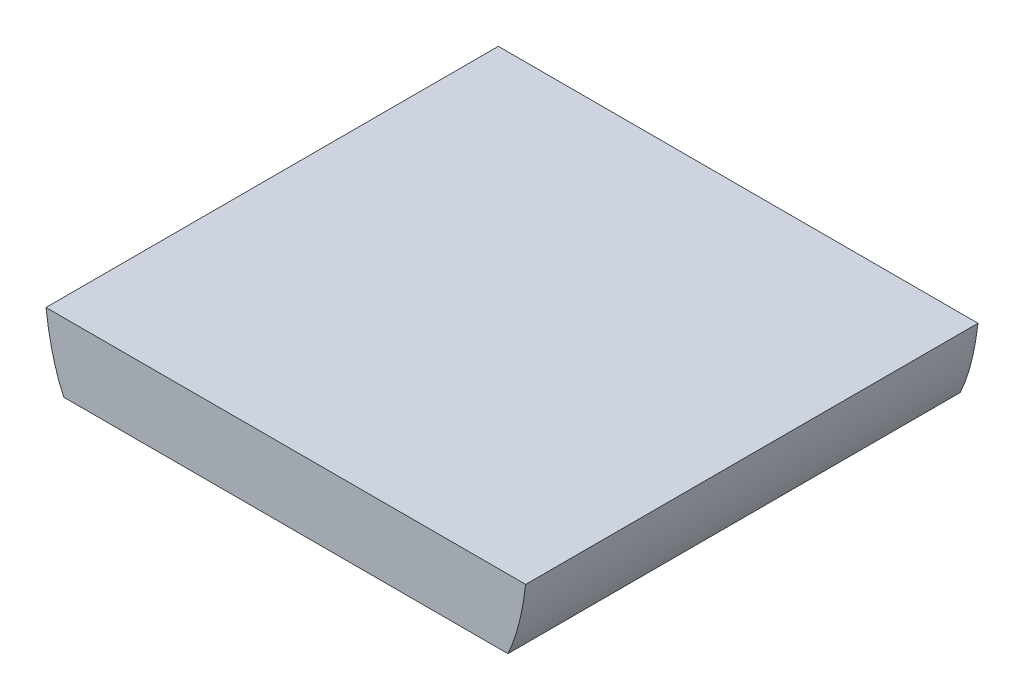
ISO-10303-21;
HEADER;
FILE_DESCRIPTION(('STEP AP214'),'2;1');
FILE_NAME('part.step','',(''),(''),'','','');
FILE_SCHEMA(('AUTOMOTIVE_DESIGN { 1 0 10303 214 1 1 1 1 }'));
ENDSEC;
DATA;
#1=APPLICATION_CONTEXT('core data for automotive mechanical design processes');
#2=APPLICATION_PROTOCOL_DEFINITION('international standard','automotive_design',2000,#1);
#3=PRODUCT_CONTEXT('',#1,'mechanical');
#4=PRODUCT('Part','Part','',(#3));
#5=PRODUCT_RELATED_PRODUCT_CATEGORY('part','',(#4));
#6=PRODUCT_DEFINITION_FORMATION('','',#4);
#7=PRODUCT_DEFINITION_CONTEXT('part definition',#1,'design');
#8=PRODUCT_DEFINITION('design','',#6,#7);
#9=PRODUCT_DEFINITION_SHAPE('','',#8);
#10=(LENGTH_UNIT() NAMED_UNIT(*) SI_UNIT(.MILLI.,.METRE.));
#11=(NAMED_UNIT(*) PLANE_ANGLE_UNIT() SI_UNIT($,.RADIAN.));
#12=(NAMED_UNIT(*) SI_UNIT($,.STERADIAN.) SOLID_ANGLE_UNIT());
#13=UNCERTAINTY_MEASURE_WITH_UNIT(LENGTH_MEASURE(1.E-05),#10,'distance_accuracy_value','');
#14=(GEOMETRIC_REPRESENTATION_CONTEXT(3) GLOBAL_UNCERTAINTY_ASSIGNED_CONTEXT((#13)) GLOBAL_UNIT_ASSIGNED_CONTEXT((#10,
#11,#12)) REPRESENTATION_CONTEXT('',''));
#15=CARTESIAN_POINT('',(0.,0.,0.));
#16=DIRECTION('',(0.,0.,1.));
#17=DIRECTION('',(1.,0.,0.));
#18=AXIS2_PLACEMENT_3D('',#15,#16,#17);
#19=CARTESIAN_POINT('',(-363.688822471691,122.174,-330.21));
#20=DIRECTION('',(0.,-1.,0.));
#21=DIRECTION('',(0.,0.,-1.));
#22=AXIS2_PLACEMENT_3D('',#19,#20,#21);
#23=PLANE('',#22);
#24=DIRECTION('',(1.,0.,0.));
#25=VECTOR('',#24,1.);
#26=CARTESIAN_POINT('',(259.810264330809,122.174,330.2));
#27=LINE('',#26,#25);
#28=CARTESIAN_POINT('',(-324.227116913687,122.174,330.2));
#29=VERTEX_POINT('',#28);
#30=CARTESIAN_POINT('',(324.227116913687,122.174,330.2));
#31=VERTEX_POINT('',#30);
#32=EDGE_CURVE('E94',#29,#31,#27,.T.);
#33=ORIENTED_EDGE('',*,*,#32,.F.);
#34=DIRECTION('',(0.,0.,-1.));
#35=VECTOR('',#34,1.);
#36=CARTESIAN_POINT('',(-324.227116913687,122.174,330.2));
#37=LINE('',#36,#35);
#38=CARTESIAN_POINT('',(-324.227116913687,122.174,-330.2));
#39=VERTEX_POINT('',#38);
#40=EDGE_CURVE('E95',#29,#39,#37,.T.);
#41=ORIENTED_EDGE('',*,*,#40,.T.);
#42=DIRECTION('',(1.,0.,0.));
#43=VECTOR('',#42,1.);
#44=CARTESIAN_POINT('',(259.810264330809,122.174,-330.2));
#45=LINE('',#44,#43);
#46=CARTESIAN_POINT('',(324.227116913687,122.174,-330.2));
#47=VERTEX_POINT('',#46);
#48=EDGE_CURVE('E84',#39,#47,#45,.T.);
#49=ORIENTED_EDGE('',*,*,#48,.T.);
#50=DIRECTION('',(0.,0.,-1.));
#51=VECTOR('',#50,1.);
#52=CARTESIAN_POINT('',(324.227116913687,122.174,330.2));
#53=LINE('',#52,#51);
#54=EDGE_CURVE('E89',#31,#47,#53,.T.);
#55=ORIENTED_EDGE('',*,*,#54,.F.);
#56=EDGE_LOOP('',(#33,#41,#49,#55));
#57=FACE_BOUND('',#56,.T.);
#58=ADVANCED_FACE('F36',(#57),#23,.T.);
#59=CARTESIAN_POINT('',(-350.176916026057,222.758,330.2));
#60=CARTESIAN_POINT('',(-323.602122165327,0.,330.2));
#61=CARTESIAN_POINT('',(0.,0.,330.2));
#62=(BOUNDED_CURVE() B_SPLINE_CURVE(2,(#59,#60,#61),.UNSPECIFIED.,.F.,
.F.) B_SPLINE_CURVE_WITH_KNOTS((3,3),(0.,1.),
.UNSPECIFIED.) CURVE() GEOMETRIC_REPRESENTATION_ITEM() RATIONAL_B_SPLINE_CURVE((1.,
1.32809749071042,1.)) REPRESENTATION_ITEM(''));
#63=DIRECTION('',(0.,0.,-1.));
#64=VECTOR('',#63,1.);
#65=SURFACE_OF_LINEAR_EXTRUSION('',#62,#64);
#66=ORIENTED_EDGE('',*,*,#40,.F.);
#67=CARTESIAN_POINT('',(-350.176916026057,222.758,330.2));
#68=VERTEX_POINT('',#67);
#69=EDGE_CURVE('E108',#68,#29,#62,.T.);
#70=ORIENTED_EDGE('',*,*,#69,.F.);
#71=DIRECTION('',(0.,0.,-1.));
#72=VECTOR('',#71,1.);
#73=CARTESIAN_POINT('',(-350.176916026057,222.758,330.2));
#74=LINE('',#73,#72);
#75=CARTESIAN_POINT('',(-350.176916026057,222.758,-330.2));
#76=VERTEX_POINT('',#75);
#77=EDGE_CURVE('E62',#68,#76,#74,.T.);
#78=ORIENTED_EDGE('',*,*,#77,.T.);
#79=CARTESIAN_POINT('',(-350.176916026057,222.758,-330.2));
#80=CARTESIAN_POINT('',(-323.602122165327,0.,-330.2));
#81=CARTESIAN_POINT('',(0.,0.,-330.2));
#82=(BOUNDED_CURVE() B_SPLINE_CURVE(2,(#79,#80,#81),.UNSPECIFIED.,.F.,
.F.) B_SPLINE_CURVE_WITH_KNOTS((3,3),(0.,1.),
.UNSPECIFIED.) CURVE() GEOMETRIC_REPRESENTATION_ITEM() RATIONAL_B_SPLINE_CURVE((1.,
1.32809749071042,1.)) REPRESENTATION_ITEM(''));
#83=EDGE_CURVE('E86',#76,#39,#82,.T.);
#84=ORIENTED_EDGE('',*,*,#83,.T.);
#85=EDGE_LOOP('',(#66,#70,#78,#84));
#86=FACE_BOUND('',#85,.T.);
#87=ADVANCED_FACE('F127',(#86),#65,.F.);
#88=CARTESIAN_POINT('',(350.176916026058,222.758,330.2));
#89=CARTESIAN_POINT('',(323.602122165327,1.11022302462516E-13,330.2));
#90=CARTESIAN_POINT('',(0.,0.,330.2));
#91=(BOUNDED_CURVE() B_SPLINE_CURVE(2,(#88,#89,#90),.UNSPECIFIED.,.F.,
.F.) B_SPLINE_CURVE_WITH_KNOTS((3,3),(0.,1.),
.UNSPECIFIED.) CURVE() GEOMETRIC_REPRESENTATION_ITEM() RATIONAL_B_SPLINE_CURVE((1.,
1.32809749071042,1.)) REPRESENTATION_ITEM(''));
#92=DIRECTION('',(0.,0.,-1.));
#93=VECTOR('',#92,1.);
#94=SURFACE_OF_LINEAR_EXTRUSION('',#91,#93);
#95=CARTESIAN_POINT('',(350.176916026058,222.758,330.2));
#96=VERTEX_POINT('',#95);
#97=EDGE_CURVE('E92',#96,#31,#91,.T.);
#98=ORIENTED_EDGE('',*,*,#97,.T.);
#99=ORIENTED_EDGE('',*,*,#54,.T.);
#100=CARTESIAN_POINT('',(350.176916026058,222.758,-330.2));
#101=CARTESIAN_POINT('',(323.602122165327,1.11022302462516E-13,-330.2));
#102=CARTESIAN_POINT('',(0.,0.,-330.2));
#103=(BOUNDED_CURVE() B_SPLINE_CURVE(2,(#100,#101,#102),.UNSPECIFIED.,.F.,
.F.) B_SPLINE_CURVE_WITH_KNOTS((3,3),(0.,1.),
.UNSPECIFIED.) CURVE() GEOMETRIC_REPRESENTATION_ITEM() RATIONAL_B_SPLINE_CURVE((1.,
1.32809749071042,1.)) REPRESENTATION_ITEM(''));
#104=CARTESIAN_POINT('',(350.176916026058,222.758,-330.2));
#105=VERTEX_POINT('',#104);
#106=EDGE_CURVE('E40',#105,#47,#103,.T.);
#107=ORIENTED_EDGE('',*,*,#106,.F.);
#108=DIRECTION('',(0.,0.,-1.));
#109=VECTOR('',#108,1.);
#110=CARTESIAN_POINT('',(350.176916026058,222.758,330.2));
#111=LINE('',#110,#109);
#112=EDGE_CURVE('E54',#96,#105,#111,.T.);
#113=ORIENTED_EDGE('',*,*,#112,.F.);
#114=EDGE_LOOP('',(#98,#99,#107,#113));
#115=FACE_BOUND('',#114,.T.);
#116=ADVANCED_FACE('F90',(#115),#94,.T.);
#117=CARTESIAN_POINT('',(259.810264330809,47.8412095904167,330.2));
#118=DIRECTION('',(0.,0.,1.));
#119=DIRECTION('',(1.,0.,0.));
#120=AXIS2_PLACEMENT_3D('',#117,#118,#119);
#121=PLANE('',#120);
#122=ORIENTED_EDGE('',*,*,#69,.T.);
#123=ORIENTED_EDGE('',*,*,#32,.T.);
#124=ORIENTED_EDGE('',*,*,#97,.F.);
#125=DIRECTION('',(1.,0.,0.));
#126=VECTOR('',#125,1.);
#127=CARTESIAN_POINT('',(0.,222.758,330.2));
#128=LINE('',#127,#126);
#129=EDGE_CURVE('E103',#68,#96,#128,.T.);
#130=ORIENTED_EDGE('',*,*,#129,.F.);
#131=EDGE_LOOP('',(#122,#123,#124,#130));
#132=FACE_BOUND('',#131,.T.);
#133=ADVANCED_FACE('F38',(#132),#121,.T.);
#134=CARTESIAN_POINT('',(259.810264330809,47.8412095904167,-330.2));
#135=DIRECTION('',(0.,0.,1.));
#136=DIRECTION('',(1.,0.,0.));
#137=AXIS2_PLACEMENT_3D('',#134,#135,#136);
#138=PLANE('',#137);
#139=ORIENTED_EDGE('',*,*,#48,.F.);
#140=ORIENTED_EDGE('',*,*,#83,.F.);
#141=DIRECTION('',(1.,0.,0.));
#142=VECTOR('',#141,1.);
#143=CARTESIAN_POINT('',(0.,222.758,-330.2));
#144=LINE('',#143,#142);
#145=EDGE_CURVE('E11',#76,#105,#144,.T.);
#146=ORIENTED_EDGE('',*,*,#145,.T.);
#147=ORIENTED_EDGE('',*,*,#106,.T.);
#148=EDGE_LOOP('',(#139,#140,#146,#147));
#149=FACE_BOUND('',#148,.T.);
#150=ADVANCED_FACE('F81',(#149),#138,.F.);
#151=CARTESIAN_POINT('',(-350.176916026057,222.758,330.2));
#152=DIRECTION('',(0.,1.,0.));
#153=DIRECTION('',(0.,0.,1.));
#154=AXIS2_PLACEMENT_3D('',#151,#152,#153);
#155=PLANE('',#154);
#156=ORIENTED_EDGE('',*,*,#112,.T.);
#157=ORIENTED_EDGE('',*,*,#145,.F.);
#158=ORIENTED_EDGE('',*,*,#77,.F.);
#159=ORIENTED_EDGE('',*,*,#129,.T.);
#160=EDGE_LOOP('',(#156,#157,#158,#159));
#161=FACE_BOUND('',#160,.T.);
#162=ADVANCED_FACE('F131',(#161),#155,.T.);
#163=CLOSED_SHELL('',(#58,#87,#116,#133,#150,#162));
#164=MANIFOLD_SOLID_BREP('B2',#163);
#165=ADVANCED_BREP_SHAPE_REPRESENTATION('',(#18,#164),#14);
#166=SHAPE_DEFINITION_REPRESENTATION(#9,#165);
ENDSEC;
END-ISO-10303-21;
